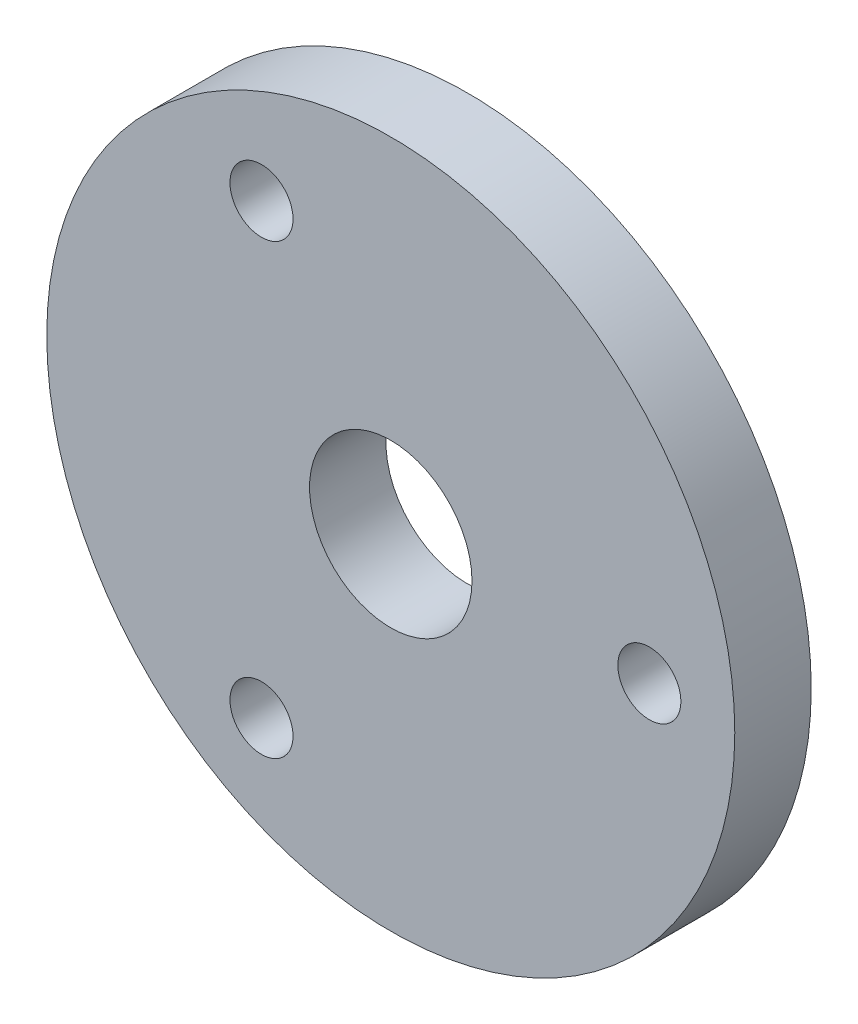
ISO-10303-21;
HEADER;
FILE_DESCRIPTION(('STEP AP214'),'2;1');
FILE_NAME('part.step','',(''),(''),'','','');
FILE_SCHEMA(('AUTOMOTIVE_DESIGN { 1 0 10303 214 1 1 1 1 }'));
ENDSEC;
DATA;
#1=APPLICATION_CONTEXT('core data for automotive mechanical design processes');
#2=APPLICATION_PROTOCOL_DEFINITION('international standard','automotive_design',2000,#1);
#3=PRODUCT_CONTEXT('',#1,'mechanical');
#4=PRODUCT('Part','Part','',(#3));
#5=PRODUCT_RELATED_PRODUCT_CATEGORY('part','',(#4));
#6=PRODUCT_DEFINITION_FORMATION('','',#4);
#7=PRODUCT_DEFINITION_CONTEXT('part definition',#1,'design');
#8=PRODUCT_DEFINITION('design','',#6,#7);
#9=PRODUCT_DEFINITION_SHAPE('','',#8);
#10=(LENGTH_UNIT() NAMED_UNIT(*) SI_UNIT(.MILLI.,.METRE.));
#11=(NAMED_UNIT(*) PLANE_ANGLE_UNIT() SI_UNIT($,.RADIAN.));
#12=(NAMED_UNIT(*) SI_UNIT($,.STERADIAN.) SOLID_ANGLE_UNIT());
#13=UNCERTAINTY_MEASURE_WITH_UNIT(LENGTH_MEASURE(1.E-05),#10,'distance_accuracy_value','');
#14=(GEOMETRIC_REPRESENTATION_CONTEXT(3) GLOBAL_UNCERTAINTY_ASSIGNED_CONTEXT((#13)) GLOBAL_UNIT_ASSIGNED_CONTEXT((#10,
#11,#12)) REPRESENTATION_CONTEXT('',''));
#15=CARTESIAN_POINT('',(0.,0.,0.));
#16=DIRECTION('',(0.,0.,1.));
#17=DIRECTION('',(1.,0.,0.));
#18=AXIS2_PLACEMENT_3D('',#15,#16,#17);
#19=CARTESIAN_POINT('',(-0.736666666666666,0.0914025565855618,4.));
#20=DIRECTION('',(0.,0.,1.));
#21=DIRECTION('',(1.,0.,0.));
#22=AXIS2_PLACEMENT_3D('',#19,#20,#21);
#23=PLANE('',#22);
#24=CARTESIAN_POINT('',(-7.50166666666672,-11.6259211566179,4.));
#25=DIRECTION('',(0.,0.,1.));
#26=DIRECTION('',(1.,0.,0.));
#27=AXIS2_PLACEMENT_3D('',#24,#25,#26);
#28=CIRCLE('',#27,1.65);
#29=CARTESIAN_POINT('',(-5.85166666666673,-11.6259211566179,4.));
#30=VERTEX_POINT('',#29);
#31=EDGE_CURVE('E53',#30,#30,#28,.T.);
#32=ORIENTED_EDGE('',*,*,#31,.F.);
#33=EDGE_LOOP('',(#32));
#34=FACE_BOUND('',#33,.T.);
#35=CARTESIAN_POINT('',(12.7933333333333,0.0914025565855618,4.));
#36=DIRECTION('',(0.,0.,1.));
#37=DIRECTION('',(1.,0.,0.));
#38=AXIS2_PLACEMENT_3D('',#35,#36,#37);
#39=CIRCLE('',#38,1.65);
#40=CARTESIAN_POINT('',(14.4433333333333,0.0914025565855618,4.));
#41=VERTEX_POINT('',#40);
#42=EDGE_CURVE('E42',#41,#41,#39,.T.);
#43=ORIENTED_EDGE('',*,*,#42,.F.);
#44=EDGE_LOOP('',(#43));
#45=FACE_BOUND('',#44,.T.);
#46=CARTESIAN_POINT('',(-0.736666666666666,0.0914025565855618,4.));
#47=DIRECTION('',(0.,0.,1.));
#48=DIRECTION('',(1.,0.,0.));
#49=AXIS2_PLACEMENT_3D('',#46,#47,#48);
#50=CIRCLE('',#49,18.);
#51=CARTESIAN_POINT('',(17.2633333333333,0.0914025565855618,4.));
#52=VERTEX_POINT('',#51);
#53=EDGE_CURVE('E10',#52,#52,#50,.T.);
#54=ORIENTED_EDGE('',*,*,#53,.T.);
#55=EDGE_LOOP('',(#54));
#56=FACE_BOUND('',#55,.T.);
#57=CARTESIAN_POINT('',(-0.736666666666666,0.0914025565855618,4.));
#58=DIRECTION('',(0.,0.,1.));
#59=DIRECTION('',(1.,0.,0.));
#60=AXIS2_PLACEMENT_3D('',#57,#58,#59);
#61=CIRCLE('',#60,4.25);
#62=CARTESIAN_POINT('',(3.51333333333333,0.0914025565855618,4.));
#63=VERTEX_POINT('',#62);
#64=EDGE_CURVE('E47',#63,#63,#61,.T.);
#65=ORIENTED_EDGE('',*,*,#64,.F.);
#66=EDGE_LOOP('',(#65));
#67=FACE_BOUND('',#66,.T.);
#68=CARTESIAN_POINT('',(-7.50166666666656,11.8087262697891,4.));
#69=DIRECTION('',(0.,0.,1.));
#70=DIRECTION('',(1.,0.,0.));
#71=AXIS2_PLACEMENT_3D('',#68,#69,#70);
#72=CIRCLE('',#71,1.65);
#73=CARTESIAN_POINT('',(-5.85166666666656,11.8087262697891,4.));
#74=VERTEX_POINT('',#73);
#75=EDGE_CURVE('E59',#74,#74,#72,.T.);
#76=ORIENTED_EDGE('',*,*,#75,.F.);
#77=EDGE_LOOP('',(#76));
#78=FACE_BOUND('',#77,.T.);
#79=ADVANCED_FACE('F31',(#34,#45,#56,#67,#78),#23,.T.);
#80=CARTESIAN_POINT('',(-0.736666666666666,0.0914025565855618,0.));
#81=DIRECTION('',(0.,0.,1.));
#82=DIRECTION('',(1.,0.,0.));
#83=AXIS2_PLACEMENT_3D('',#80,#81,#82);
#84=PLANE('',#83);
#85=CARTESIAN_POINT('',(-0.736666666666666,0.0914025565855618,0.));
#86=DIRECTION('',(0.,0.,1.));
#87=DIRECTION('',(1.,0.,0.));
#88=AXIS2_PLACEMENT_3D('',#85,#86,#87);
#89=CIRCLE('',#88,18.);
#90=CARTESIAN_POINT('',(17.2633333333333,0.0914025565855618,0.));
#91=VERTEX_POINT('',#90);
#92=EDGE_CURVE('E35',#91,#91,#89,.T.);
#93=ORIENTED_EDGE('',*,*,#92,.F.);
#94=EDGE_LOOP('',(#93));
#95=FACE_BOUND('',#94,.T.);
#96=CARTESIAN_POINT('',(12.7933333333333,0.0914025565855618,0.));
#97=DIRECTION('',(0.,0.,1.));
#98=DIRECTION('',(1.,0.,0.));
#99=AXIS2_PLACEMENT_3D('',#96,#97,#98);
#100=CIRCLE('',#99,1.65);
#101=CARTESIAN_POINT('',(14.4433333333333,0.0914025565855618,0.));
#102=VERTEX_POINT('',#101);
#103=EDGE_CURVE('E44',#102,#102,#100,.T.);
#104=ORIENTED_EDGE('',*,*,#103,.T.);
#105=EDGE_LOOP('',(#104));
#106=FACE_BOUND('',#105,.T.);
#107=CARTESIAN_POINT('',(-0.736666666666666,0.0914025565855618,0.));
#108=DIRECTION('',(0.,0.,1.));
#109=DIRECTION('',(1.,0.,0.));
#110=AXIS2_PLACEMENT_3D('',#107,#108,#109);
#111=CIRCLE('',#110,4.25);
#112=CARTESIAN_POINT('',(3.51333333333333,0.0914025565855618,0.));
#113=VERTEX_POINT('',#112);
#114=EDGE_CURVE('E50',#113,#113,#111,.T.);
#115=ORIENTED_EDGE('',*,*,#114,.T.);
#116=EDGE_LOOP('',(#115));
#117=FACE_BOUND('',#116,.T.);
#118=CARTESIAN_POINT('',(-7.50166666666672,-11.6259211566179,0.));
#119=DIRECTION('',(0.,0.,1.));
#120=DIRECTION('',(1.,0.,0.));
#121=AXIS2_PLACEMENT_3D('',#118,#119,#120);
#122=CIRCLE('',#121,1.65);
#123=CARTESIAN_POINT('',(-5.85166666666673,-11.6259211566179,0.));
#124=VERTEX_POINT('',#123);
#125=EDGE_CURVE('E56',#124,#124,#122,.T.);
#126=ORIENTED_EDGE('',*,*,#125,.T.);
#127=EDGE_LOOP('',(#126));
#128=FACE_BOUND('',#127,.T.);
#129=CARTESIAN_POINT('',(-7.50166666666656,11.8087262697891,0.));
#130=DIRECTION('',(0.,0.,1.));
#131=DIRECTION('',(1.,0.,0.));
#132=AXIS2_PLACEMENT_3D('',#129,#130,#131);
#133=CIRCLE('',#132,1.65);
#134=CARTESIAN_POINT('',(-5.85166666666656,11.8087262697891,0.));
#135=VERTEX_POINT('',#134);
#136=EDGE_CURVE('E62',#135,#135,#133,.T.);
#137=ORIENTED_EDGE('',*,*,#136,.T.);
#138=EDGE_LOOP('',(#137));
#139=FACE_BOUND('',#138,.T.);
#140=ADVANCED_FACE('F72',(#95,#106,#117,#128,#139),#84,.F.);
#141=CARTESIAN_POINT('',(-0.736666666666666,0.0914025565855618,4.));
#142=DIRECTION('',(0.,0.,-1.));
#143=DIRECTION('',(-1.,0.,0.));
#144=AXIS2_PLACEMENT_3D('',#141,#142,#143);
#145=CYLINDRICAL_SURFACE('',#144,18.);
#146=ORIENTED_EDGE('',*,*,#53,.F.);
#147=EDGE_LOOP('',(#146));
#148=FACE_BOUND('',#147,.T.);
#149=ORIENTED_EDGE('',*,*,#92,.T.);
#150=EDGE_LOOP('',(#149));
#151=FACE_BOUND('',#150,.T.);
#152=ADVANCED_FACE('F33',(#148,#151),#145,.T.);
#153=CARTESIAN_POINT('',(12.7933333333333,0.0914025565855618,4.));
#154=DIRECTION('',(0.,0.,-1.));
#155=DIRECTION('',(-1.,0.,0.));
#156=AXIS2_PLACEMENT_3D('',#153,#154,#155);
#157=CYLINDRICAL_SURFACE('',#156,1.65);
#158=ORIENTED_EDGE('',*,*,#42,.T.);
#159=EDGE_LOOP('',(#158));
#160=FACE_BOUND('',#159,.T.);
#161=ORIENTED_EDGE('',*,*,#103,.F.);
#162=EDGE_LOOP('',(#161));
#163=FACE_BOUND('',#162,.T.);
#164=ADVANCED_FACE('F82',(#160,#163),#157,.F.);
#165=CARTESIAN_POINT('',(-0.736666666666666,0.0914025565855618,4.));
#166=DIRECTION('',(0.,0.,-1.));
#167=DIRECTION('',(-1.,0.,0.));
#168=AXIS2_PLACEMENT_3D('',#165,#166,#167);
#169=CYLINDRICAL_SURFACE('',#168,4.25);
#170=ORIENTED_EDGE('',*,*,#64,.T.);
#171=EDGE_LOOP('',(#170));
#172=FACE_BOUND('',#171,.T.);
#173=ORIENTED_EDGE('',*,*,#114,.F.);
#174=EDGE_LOOP('',(#173));
#175=FACE_BOUND('',#174,.T.);
#176=ADVANCED_FACE('F85',(#172,#175),#169,.F.);
#177=CARTESIAN_POINT('',(-7.50166666666672,-11.6259211566179,4.));
#178=DIRECTION('',(0.,0.,-1.));
#179=DIRECTION('',(-1.,0.,0.));
#180=AXIS2_PLACEMENT_3D('',#177,#178,#179);
#181=CYLINDRICAL_SURFACE('',#180,1.65);
#182=ORIENTED_EDGE('',*,*,#31,.T.);
#183=EDGE_LOOP('',(#182));
#184=FACE_BOUND('',#183,.T.);
#185=ORIENTED_EDGE('',*,*,#125,.F.);
#186=EDGE_LOOP('',(#185));
#187=FACE_BOUND('',#186,.T.);
#188=ADVANCED_FACE('F89',(#184,#187),#181,.F.);
#189=CARTESIAN_POINT('',(-7.50166666666656,11.8087262697891,4.));
#190=DIRECTION('',(0.,0.,-1.));
#191=DIRECTION('',(-1.,0.,0.));
#192=AXIS2_PLACEMENT_3D('',#189,#190,#191);
#193=CYLINDRICAL_SURFACE('',#192,1.65);
#194=ORIENTED_EDGE('',*,*,#75,.T.);
#195=EDGE_LOOP('',(#194));
#196=FACE_BOUND('',#195,.T.);
#197=ORIENTED_EDGE('',*,*,#136,.F.);
#198=EDGE_LOOP('',(#197));
#199=FACE_BOUND('',#198,.T.);
#200=ADVANCED_FACE('F68',(#196,#199),#193,.F.);
#201=CLOSED_SHELL('',(#79,#140,#152,#164,#176,#188,#200));
#202=MANIFOLD_SOLID_BREP('B2',#201);
#203=ADVANCED_BREP_SHAPE_REPRESENTATION('',(#18,#202),#14);
#204=SHAPE_DEFINITION_REPRESENTATION(#9,#203);
ENDSEC;
END-ISO-10303-21;
